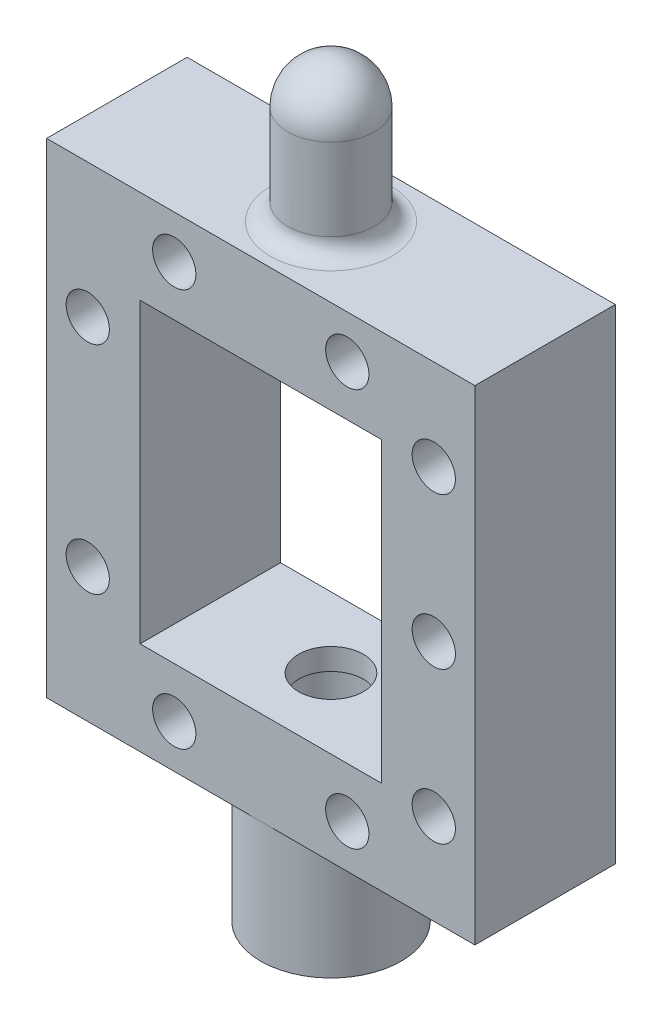
ISO-10303-21;
HEADER;
FILE_DESCRIPTION(('STEP AP214'),'2;1');
FILE_NAME('part.step','',(''),(''),'','','');
FILE_SCHEMA(('AUTOMOTIVE_DESIGN { 1 0 10303 214 1 1 1 1 }'));
ENDSEC;
DATA;
#1=APPLICATION_CONTEXT('core data for automotive mechanical design processes');
#2=APPLICATION_PROTOCOL_DEFINITION('international standard','automotive_design',2000,#1);
#3=PRODUCT_CONTEXT('',#1,'mechanical');
#4=PRODUCT('Part','Part','',(#3));
#5=PRODUCT_RELATED_PRODUCT_CATEGORY('part','',(#4));
#6=PRODUCT_DEFINITION_FORMATION('','',#4);
#7=PRODUCT_DEFINITION_CONTEXT('part definition',#1,'design');
#8=PRODUCT_DEFINITION('design','',#6,#7);
#9=PRODUCT_DEFINITION_SHAPE('','',#8);
#10=(LENGTH_UNIT() NAMED_UNIT(*) SI_UNIT(.MILLI.,.METRE.));
#11=(NAMED_UNIT(*) PLANE_ANGLE_UNIT() SI_UNIT($,.RADIAN.));
#12=(NAMED_UNIT(*) SI_UNIT($,.STERADIAN.) SOLID_ANGLE_UNIT());
#13=UNCERTAINTY_MEASURE_WITH_UNIT(LENGTH_MEASURE(1.E-05),#10,'distance_accuracy_value','');
#14=(GEOMETRIC_REPRESENTATION_CONTEXT(3) GLOBAL_UNCERTAINTY_ASSIGNED_CONTEXT((#13)) GLOBAL_UNIT_ASSIGNED_CONTEXT((#10,
#11,#12)) REPRESENTATION_CONTEXT('',''));
#15=CARTESIAN_POINT('',(0.,0.,0.));
#16=DIRECTION('',(0.,0.,1.));
#17=DIRECTION('',(1.,0.,0.));
#18=AXIS2_PLACEMENT_3D('',#15,#16,#17);
#19=CARTESIAN_POINT('',(0.,-53.34,10.3124));
#20=DIRECTION('',(0.,1.,0.));
#21=DIRECTION('',(0.,0.,1.));
#22=AXIS2_PLACEMENT_3D('',#19,#20,#21);
#23=CYLINDRICAL_SURFACE('',#22,10.3124);
#24=DIRECTION('',(0.,-1.,0.));
#25=VECTOR('',#24,1.);
#26=CARTESIAN_POINT('',(-7.39959695393663,-35.56,3.12967359011276));
#27=LINE('',#26,#25);
#28=CARTESIAN_POINT('',(-7.39959695393663,-35.56,3.12967359011276));
#29=VERTEX_POINT('',#28);
#30=CARTESIAN_POINT('',(-7.39959695393663,-53.34,3.12967359011276));
#31=VERTEX_POINT('',#30);
#32=EDGE_CURVE('E119',#29,#31,#27,.T.);
#33=ORIENTED_EDGE('',*,*,#32,.T.);
#34=CARTESIAN_POINT('',(0.,-53.34,10.3124));
#35=DIRECTION('',(0.,-1.,0.));
#36=DIRECTION('',(0.,0.,-1.));
#37=AXIS2_PLACEMENT_3D('',#34,#35,#36);
#38=CIRCLE('',#37,10.3124);
#39=CARTESIAN_POINT('',(7.39959695393663,-53.34,3.12967359011275));
#40=VERTEX_POINT('',#39);
#41=EDGE_CURVE('E125',#40,#31,#38,.T.);
#42=ORIENTED_EDGE('',*,*,#41,.F.);
#43=DIRECTION('',(0.,-1.,0.));
#44=VECTOR('',#43,1.);
#45=CARTESIAN_POINT('',(7.39959695393663,-35.56,3.12967359011276));
#46=LINE('',#45,#44);
#47=CARTESIAN_POINT('',(7.39959695393663,-35.56,3.12967359011276));
#48=VERTEX_POINT('',#47);
#49=EDGE_CURVE('E54',#48,#40,#46,.T.);
#50=ORIENTED_EDGE('',*,*,#49,.F.);
#51=CARTESIAN_POINT('',(0.,-35.56,10.3124));
#52=DIRECTION('',(0.,-1.,0.));
#53=DIRECTION('',(0.,0.,-1.));
#54=AXIS2_PLACEMENT_3D('',#51,#52,#53);
#55=CIRCLE('',#54,10.3124);
#56=CARTESIAN_POINT('',(0.,-35.56,20.6248));
#57=VERTEX_POINT('',#56);
#58=EDGE_CURVE('E47',#48,#57,#55,.T.);
#59=ORIENTED_EDGE('',*,*,#58,.T.);
#60=EDGE_CURVE('E11',#57,#29,#55,.T.);
#61=ORIENTED_EDGE('',*,*,#60,.T.);
#62=EDGE_LOOP('',(#33,#42,#50,#59,#61));
#63=FACE_BOUND('',#62,.T.);
#64=ADVANCED_FACE('F37',(#63),#23,.T.);
#65=CARTESIAN_POINT('',(0.,-53.34,10.3124));
#66=DIRECTION('',(0.,-1.,0.));
#67=DIRECTION('',(0.,0.,-1.));
#68=AXIS2_PLACEMENT_3D('',#65,#66,#67);
#69=PLANE('',#68);
#70=CARTESIAN_POINT('',(0.,-53.34,10.3124));
#71=DIRECTION('',(0.,-1.,0.));
#72=DIRECTION('',(0.,0.,-1.));
#73=AXIS2_PLACEMENT_3D('',#70,#71,#72);
#74=CIRCLE('',#73,5.75436999999999);
#75=CARTESIAN_POINT('',(0.,-53.34,4.55803000000001));
#76=VERTEX_POINT('',#75);
#77=EDGE_CURVE('E395',#76,#76,#74,.T.);
#78=ORIENTED_EDGE('',*,*,#77,.F.);
#79=EDGE_LOOP('',(#78));
#80=FACE_BOUND('',#79,.T.);
#81=ORIENTED_EDGE('',*,*,#41,.T.);
#82=DIRECTION('',(1.,0.,0.));
#83=VECTOR('',#82,1.);
#84=CARTESIAN_POINT('',(-7.39959695393663,-53.34,3.12967359011276));
#85=LINE('',#84,#83);
#86=EDGE_CURVE('E121',#31,#40,#85,.T.);
#87=ORIENTED_EDGE('',*,*,#86,.T.);
#88=EDGE_LOOP('',(#81,#87));
#89=FACE_BOUND('',#88,.T.);
#90=ADVANCED_FACE('F283',(#80,#89),#69,.T.);
#91=CARTESIAN_POINT('',(31.4325,35.56,20.6248));
#92=DIRECTION('',(-1.,0.,0.));
#93=DIRECTION('',(0.,-1.,0.));
#94=AXIS2_PLACEMENT_3D('',#91,#92,#93);
#95=PLANE('',#94);
#96=DIRECTION('',(0.,1.,0.));
#97=VECTOR('',#96,1.);
#98=CARTESIAN_POINT('',(31.4325,35.56,0.));
#99=LINE('',#98,#97);
#100=CARTESIAN_POINT('',(31.4325,-35.56,0.));
#101=VERTEX_POINT('',#100);
#102=CARTESIAN_POINT('',(31.4325,35.56,0.));
#103=VERTEX_POINT('',#102);
#104=EDGE_CURVE('E230',#101,#103,#99,.T.);
#105=ORIENTED_EDGE('',*,*,#104,.T.);
#106=DIRECTION('',(0.,0.,-1.));
#107=VECTOR('',#106,1.);
#108=CARTESIAN_POINT('',(31.4325,35.56,20.6248));
#109=LINE('',#108,#107);
#110=CARTESIAN_POINT('',(31.4325,35.56,20.6248));
#111=VERTEX_POINT('',#110);
#112=EDGE_CURVE('E257',#111,#103,#109,.T.);
#113=ORIENTED_EDGE('',*,*,#112,.F.);
#114=DIRECTION('',(0.,1.,0.));
#115=VECTOR('',#114,1.);
#116=CARTESIAN_POINT('',(31.4325,35.56,20.6248));
#117=LINE('',#116,#115);
#118=CARTESIAN_POINT('',(31.4325,-35.56,20.6248));
#119=VERTEX_POINT('',#118);
#120=EDGE_CURVE('E231',#119,#111,#117,.T.);
#121=ORIENTED_EDGE('',*,*,#120,.F.);
#122=DIRECTION('',(0.,0.,-1.));
#123=VECTOR('',#122,1.);
#124=CARTESIAN_POINT('',(31.4325,-35.56,20.6248));
#125=LINE('',#124,#123);
#126=EDGE_CURVE('E241',#119,#101,#125,.T.);
#127=ORIENTED_EDGE('',*,*,#126,.T.);
#128=EDGE_LOOP('',(#105,#113,#121,#127));
#129=FACE_BOUND('',#128,.T.);
#130=ADVANCED_FACE('F289',(#129),#95,.F.);
#131=CARTESIAN_POINT('',(-31.4325,35.56,20.6248));
#132=DIRECTION('',(0.,-1.,0.));
#133=DIRECTION('',(1.,0.,0.));
#134=AXIS2_PLACEMENT_3D('',#131,#132,#133);
#135=PLANE('',#134);
#136=CARTESIAN_POINT('',(0.,35.56,10.3124));
#137=DIRECTION('',(0.,-1.,0.));
#138=DIRECTION('',(1.,0.,0.));
#139=AXIS2_PLACEMENT_3D('',#136,#137,#138);
#140=CIRCLE('',#139,8.89);
#141=CARTESIAN_POINT('',(8.89,35.56,10.3124));
#142=VERTEX_POINT('',#141);
#143=EDGE_CURVE('E259',#142,#142,#140,.T.);
#144=ORIENTED_EDGE('',*,*,#143,.T.);
#145=EDGE_LOOP('',(#144));
#146=FACE_BOUND('',#145,.T.);
#147=DIRECTION('',(-1.,0.,0.));
#148=VECTOR('',#147,1.);
#149=CARTESIAN_POINT('',(-31.4325,35.56,0.));
#150=LINE('',#149,#148);
#151=CARTESIAN_POINT('',(-31.4325,35.56,0.));
#152=VERTEX_POINT('',#151);
#153=EDGE_CURVE('E244',#103,#152,#150,.T.);
#154=ORIENTED_EDGE('',*,*,#153,.T.);
#155=DIRECTION('',(0.,0.,-1.));
#156=VECTOR('',#155,1.);
#157=CARTESIAN_POINT('',(-31.4325,35.56,20.6248));
#158=LINE('',#157,#156);
#159=CARTESIAN_POINT('',(-31.4325,35.56,20.6248));
#160=VERTEX_POINT('',#159);
#161=EDGE_CURVE('E254',#160,#152,#158,.T.);
#162=ORIENTED_EDGE('',*,*,#161,.F.);
#163=DIRECTION('',(-1.,0.,0.));
#164=VECTOR('',#163,1.);
#165=CARTESIAN_POINT('',(-31.4325,35.56,20.6248));
#166=LINE('',#165,#164);
#167=EDGE_CURVE('E234',#111,#160,#166,.T.);
#168=ORIENTED_EDGE('',*,*,#167,.F.);
#169=ORIENTED_EDGE('',*,*,#112,.T.);
#170=EDGE_LOOP('',(#154,#162,#168,#169));
#171=FACE_BOUND('',#170,.T.);
#172=ADVANCED_FACE('F364',(#146,#171),#135,.F.);
#173=CARTESIAN_POINT('',(-31.4325,35.56,20.6248));
#174=DIRECTION('',(1.,0.,0.));
#175=DIRECTION('',(0.,0.,-1.));
#176=AXIS2_PLACEMENT_3D('',#173,#174,#175);
#177=PLANE('',#176);
#178=DIRECTION('',(0.,-1.,0.));
#179=VECTOR('',#178,1.);
#180=CARTESIAN_POINT('',(-31.4325,35.56,0.));
#181=LINE('',#180,#179);
#182=CARTESIAN_POINT('',(-31.4325,-35.56,0.));
#183=VERTEX_POINT('',#182);
#184=EDGE_CURVE('E246',#152,#183,#181,.T.);
#185=ORIENTED_EDGE('',*,*,#184,.T.);
#186=DIRECTION('',(0.,0.,-1.));
#187=VECTOR('',#186,1.);
#188=CARTESIAN_POINT('',(-31.4325,-35.56,20.6248));
#189=LINE('',#188,#187);
#190=CARTESIAN_POINT('',(-31.4325,-35.56,20.6248));
#191=VERTEX_POINT('',#190);
#192=EDGE_CURVE('E251',#191,#183,#189,.T.);
#193=ORIENTED_EDGE('',*,*,#192,.F.);
#194=DIRECTION('',(0.,-1.,0.));
#195=VECTOR('',#194,1.);
#196=CARTESIAN_POINT('',(-31.4325,35.56,20.6248));
#197=LINE('',#196,#195);
#198=EDGE_CURVE('E237',#160,#191,#197,.T.);
#199=ORIENTED_EDGE('',*,*,#198,.F.);
#200=ORIENTED_EDGE('',*,*,#161,.T.);
#201=EDGE_LOOP('',(#185,#193,#199,#200));
#202=FACE_BOUND('',#201,.T.);
#203=ADVANCED_FACE('F361',(#202),#177,.F.);
#204=CARTESIAN_POINT('',(-31.4325,-35.56,20.6248));
#205=DIRECTION('',(0.,1.,0.));
#206=DIRECTION('',(0.,0.,1.));
#207=AXIS2_PLACEMENT_3D('',#204,#205,#206);
#208=PLANE('',#207);
#209=ORIENTED_EDGE('',*,*,#60,.F.);
#210=DIRECTION('',(1.,0.,0.));
#211=VECTOR('',#210,1.);
#212=CARTESIAN_POINT('',(-31.4325,-35.56,20.6248));
#213=LINE('',#212,#211);
#214=EDGE_CURVE('E239',#191,#57,#213,.T.);
#215=ORIENTED_EDGE('',*,*,#214,.F.);
#216=ORIENTED_EDGE('',*,*,#192,.T.);
#217=DIRECTION('',(1.,0.,0.));
#218=VECTOR('',#217,1.);
#219=CARTESIAN_POINT('',(-31.4325,-35.56,0.));
#220=LINE('',#219,#218);
#221=EDGE_CURVE('E235',#183,#101,#220,.T.);
#222=ORIENTED_EDGE('',*,*,#221,.T.);
#223=ORIENTED_EDGE('',*,*,#126,.F.);
#224=EDGE_CURVE('E130',#57,#119,#213,.T.);
#225=ORIENTED_EDGE('',*,*,#224,.F.);
#226=ORIENTED_EDGE('',*,*,#58,.F.);
#227=DIRECTION('',(1.,0.,0.));
#228=VECTOR('',#227,1.);
#229=CARTESIAN_POINT('',(-5.79537806139285,-35.56,3.12967359011275));
#230=LINE('',#229,#228);
#231=EDGE_CURVE('E116',#29,#48,#230,.T.);
#232=ORIENTED_EDGE('',*,*,#231,.F.);
#233=EDGE_LOOP('',(#209,#215,#216,#222,#223,#225,#226,#232));
#234=FACE_BOUND('',#233,.T.);
#235=ADVANCED_FACE('F128',(#234),#208,.F.);
#236=CARTESIAN_POINT('',(0.,0.,20.6248));
#237=DIRECTION('',(0.,0.,1.));
#238=DIRECTION('',(1.,0.,0.));
#239=AXIS2_PLACEMENT_3D('',#236,#237,#238);
#240=PLANE('',#239);
#241=DIRECTION('',(0.,1.,0.));
#242=VECTOR('',#241,1.);
#243=CARTESIAN_POINT('',(17.7165,21.844,20.6248));
#244=LINE('',#243,#242);
#245=CARTESIAN_POINT('',(17.7165,-21.844,20.6248));
#246=VERTEX_POINT('',#245);
#247=CARTESIAN_POINT('',(17.7165,21.844,20.6248));
#248=VERTEX_POINT('',#247);
#249=EDGE_CURVE('E139',#246,#248,#244,.T.);
#250=ORIENTED_EDGE('',*,*,#249,.F.);
#251=DIRECTION('',(1.,0.,0.));
#252=VECTOR('',#251,1.);
#253=CARTESIAN_POINT('',(-17.7165,-21.844,20.6248));
#254=LINE('',#253,#252);
#255=CARTESIAN_POINT('',(-17.7165,-21.844,20.6248));
#256=VERTEX_POINT('',#255);
#257=EDGE_CURVE('E146',#256,#246,#254,.T.);
#258=ORIENTED_EDGE('',*,*,#257,.F.);
#259=DIRECTION('',(0.,-1.,0.));
#260=VECTOR('',#259,1.);
#261=CARTESIAN_POINT('',(-17.7165,21.844,20.6248));
#262=LINE('',#261,#260);
#263=CARTESIAN_POINT('',(-17.7165,21.844,20.6248));
#264=VERTEX_POINT('',#263);
#265=EDGE_CURVE('E160',#264,#256,#262,.T.);
#266=ORIENTED_EDGE('',*,*,#265,.F.);
#267=DIRECTION('',(-1.,0.,0.));
#268=VECTOR('',#267,1.);
#269=CARTESIAN_POINT('',(-17.7165,21.844,20.6248));
#270=LINE('',#269,#268);
#271=EDGE_CURVE('E157',#248,#264,#270,.T.);
#272=ORIENTED_EDGE('',*,*,#271,.F.);
#273=EDGE_LOOP('',(#250,#258,#266,#272));
#274=FACE_BOUND('',#273,.T.);
#275=CARTESIAN_POINT('',(12.7,-29.21,20.6248));
#276=DIRECTION('',(0.,0.,1.));
#277=DIRECTION('',(1.,0.,0.));
#278=AXIS2_PLACEMENT_3D('',#275,#276,#277);
#279=CIRCLE('',#278,3.175);
#280=CARTESIAN_POINT('',(15.875,-29.21,20.6248));
#281=VERTEX_POINT('',#280);
#282=EDGE_CURVE('E227',#281,#281,#279,.T.);
#283=ORIENTED_EDGE('',*,*,#282,.F.);
#284=EDGE_LOOP('',(#283));
#285=FACE_BOUND('',#284,.T.);
#286=CARTESIAN_POINT('',(-25.4,-15.875,20.6248));
#287=DIRECTION('',(0.,0.,1.));
#288=DIRECTION('',(1.,0.,0.));
#289=AXIS2_PLACEMENT_3D('',#286,#287,#288);
#290=CIRCLE('',#289,3.175);
#291=CARTESIAN_POINT('',(-22.225,-15.875,20.6248));
#292=VERTEX_POINT('',#291);
#293=EDGE_CURVE('E224',#292,#292,#290,.T.);
#294=ORIENTED_EDGE('',*,*,#293,.F.);
#295=EDGE_LOOP('',(#294));
#296=FACE_BOUND('',#295,.T.);
#297=CARTESIAN_POINT('',(-12.7,-29.21,20.6248));
#298=DIRECTION('',(0.,0.,1.));
#299=DIRECTION('',(1.,0.,0.));
#300=AXIS2_PLACEMENT_3D('',#297,#298,#299);
#301=CIRCLE('',#300,3.175);
#302=CARTESIAN_POINT('',(-9.525,-29.21,20.6248));
#303=VERTEX_POINT('',#302);
#304=EDGE_CURVE('E221',#303,#303,#301,.T.);
#305=ORIENTED_EDGE('',*,*,#304,.F.);
#306=EDGE_LOOP('',(#305));
#307=FACE_BOUND('',#306,.T.);
#308=CARTESIAN_POINT('',(-25.4,15.875,20.6248));
#309=DIRECTION('',(0.,0.,1.));
#310=DIRECTION('',(1.,0.,0.));
#311=AXIS2_PLACEMENT_3D('',#308,#309,#310);
#312=CIRCLE('',#311,3.175);
#313=CARTESIAN_POINT('',(-22.225,15.875,20.6248));
#314=VERTEX_POINT('',#313);
#315=EDGE_CURVE('E218',#314,#314,#312,.T.);
#316=ORIENTED_EDGE('',*,*,#315,.F.);
#317=EDGE_LOOP('',(#316));
#318=FACE_BOUND('',#317,.T.);
#319=CARTESIAN_POINT('',(25.4,-22.225,20.6248));
#320=DIRECTION('',(0.,0.,1.));
#321=DIRECTION('',(1.,0.,0.));
#322=AXIS2_PLACEMENT_3D('',#319,#320,#321);
#323=CIRCLE('',#322,3.175);
#324=CARTESIAN_POINT('',(28.575,-22.225,20.6248));
#325=VERTEX_POINT('',#324);
#326=EDGE_CURVE('E215',#325,#325,#323,.T.);
#327=ORIENTED_EDGE('',*,*,#326,.F.);
#328=EDGE_LOOP('',(#327));
#329=FACE_BOUND('',#328,.T.);
#330=CARTESIAN_POINT('',(25.4,22.225,20.6248));
#331=DIRECTION('',(0.,0.,1.));
#332=DIRECTION('',(1.,0.,0.));
#333=AXIS2_PLACEMENT_3D('',#330,#331,#332);
#334=CIRCLE('',#333,3.175);
#335=CARTESIAN_POINT('',(28.575,22.225,20.6248));
#336=VERTEX_POINT('',#335);
#337=EDGE_CURVE('E212',#336,#336,#334,.T.);
#338=ORIENTED_EDGE('',*,*,#337,.F.);
#339=EDGE_LOOP('',(#338));
#340=FACE_BOUND('',#339,.T.);
#341=CARTESIAN_POINT('',(25.4,0.,20.6248));
#342=DIRECTION('',(0.,0.,1.));
#343=DIRECTION('',(1.,0.,0.));
#344=AXIS2_PLACEMENT_3D('',#341,#342,#343);
#345=CIRCLE('',#344,3.175);
#346=CARTESIAN_POINT('',(28.575,0.,20.6248));
#347=VERTEX_POINT('',#346);
#348=EDGE_CURVE('E209',#347,#347,#345,.T.);
#349=ORIENTED_EDGE('',*,*,#348,.F.);
#350=EDGE_LOOP('',(#349));
#351=FACE_BOUND('',#350,.T.);
#352=CARTESIAN_POINT('',(12.7,29.21,20.6248));
#353=DIRECTION('',(0.,0.,1.));
#354=DIRECTION('',(1.,0.,0.));
#355=AXIS2_PLACEMENT_3D('',#352,#353,#354);
#356=CIRCLE('',#355,3.175);
#357=CARTESIAN_POINT('',(15.875,29.21,20.6248));
#358=VERTEX_POINT('',#357);
#359=EDGE_CURVE('E206',#358,#358,#356,.T.);
#360=ORIENTED_EDGE('',*,*,#359,.F.);
#361=EDGE_LOOP('',(#360));
#362=FACE_BOUND('',#361,.T.);
#363=CARTESIAN_POINT('',(-12.7,29.21,20.6248));
#364=DIRECTION('',(0.,0.,1.));
#365=DIRECTION('',(1.,0.,0.));
#366=AXIS2_PLACEMENT_3D('',#363,#364,#365);
#367=CIRCLE('',#366,3.175);
#368=CARTESIAN_POINT('',(-9.525,29.21,20.6248));
#369=VERTEX_POINT('',#368);
#370=EDGE_CURVE('E203',#369,#369,#367,.T.);
#371=ORIENTED_EDGE('',*,*,#370,.F.);
#372=EDGE_LOOP('',(#371));
#373=FACE_BOUND('',#372,.T.);
#374=ORIENTED_EDGE('',*,*,#120,.T.);
#375=ORIENTED_EDGE('',*,*,#167,.T.);
#376=ORIENTED_EDGE('',*,*,#198,.T.);
#377=ORIENTED_EDGE('',*,*,#214,.T.);
#378=ORIENTED_EDGE('',*,*,#224,.T.);
#379=EDGE_LOOP('',(#374,#375,#376,#377,#378));
#380=FACE_BOUND('',#379,.T.);
#381=ADVANCED_FACE('F352',(#274,#285,#296,#307,#318,#329,#340,#351,#362,#373,#380),#240,.T.);
#382=CARTESIAN_POINT('',(0.,0.,0.));
#383=DIRECTION('',(0.,0.,1.));
#384=DIRECTION('',(1.,0.,0.));
#385=AXIS2_PLACEMENT_3D('',#382,#383,#384);
#386=PLANE('',#385);
#387=DIRECTION('',(1.,0.,0.));
#388=VECTOR('',#387,1.);
#389=CARTESIAN_POINT('',(-17.7165,-21.844,0.));
#390=LINE('',#389,#388);
#391=CARTESIAN_POINT('',(-17.7165,-21.844,0.));
#392=VERTEX_POINT('',#391);
#393=CARTESIAN_POINT('',(17.7165,-21.844,0.));
#394=VERTEX_POINT('',#393);
#395=EDGE_CURVE('E152',#392,#394,#390,.T.);
#396=ORIENTED_EDGE('',*,*,#395,.T.);
#397=DIRECTION('',(0.,1.,0.));
#398=VECTOR('',#397,1.);
#399=CARTESIAN_POINT('',(17.7165,21.844,0.));
#400=LINE('',#399,#398);
#401=CARTESIAN_POINT('',(17.7165,21.844,0.));
#402=VERTEX_POINT('',#401);
#403=EDGE_CURVE('E142',#394,#402,#400,.T.);
#404=ORIENTED_EDGE('',*,*,#403,.T.);
#405=DIRECTION('',(-1.,0.,0.));
#406=VECTOR('',#405,1.);
#407=CARTESIAN_POINT('',(-17.7165,21.844,0.));
#408=LINE('',#407,#406);
#409=CARTESIAN_POINT('',(-17.7165,21.844,0.));
#410=VERTEX_POINT('',#409);
#411=EDGE_CURVE('E145',#402,#410,#408,.T.);
#412=ORIENTED_EDGE('',*,*,#411,.T.);
#413=DIRECTION('',(0.,-1.,0.));
#414=VECTOR('',#413,1.);
#415=CARTESIAN_POINT('',(-17.7165,21.844,0.));
#416=LINE('',#415,#414);
#417=EDGE_CURVE('E149',#410,#392,#416,.T.);
#418=ORIENTED_EDGE('',*,*,#417,.T.);
#419=EDGE_LOOP('',(#396,#404,#412,#418));
#420=FACE_BOUND('',#419,.T.);
#421=CARTESIAN_POINT('',(12.7,-29.21,0.));
#422=DIRECTION('',(0.,0.,1.));
#423=DIRECTION('',(1.,0.,0.));
#424=AXIS2_PLACEMENT_3D('',#421,#422,#423);
#425=CIRCLE('',#424,3.175);
#426=CARTESIAN_POINT('',(15.875,-29.21,0.));
#427=VERTEX_POINT('',#426);
#428=EDGE_CURVE('E186',#427,#427,#425,.T.);
#429=ORIENTED_EDGE('',*,*,#428,.T.);
#430=EDGE_LOOP('',(#429));
#431=FACE_BOUND('',#430,.T.);
#432=CARTESIAN_POINT('',(-25.4,-15.875,0.));
#433=DIRECTION('',(0.,0.,1.));
#434=DIRECTION('',(-1.,0.,0.));
#435=AXIS2_PLACEMENT_3D('',#432,#433,#434);
#436=CIRCLE('',#435,3.175);
#437=CARTESIAN_POINT('',(-28.575,-15.875,0.));
#438=VERTEX_POINT('',#437);
#439=EDGE_CURVE('E189',#438,#438,#436,.T.);
#440=ORIENTED_EDGE('',*,*,#439,.T.);
#441=EDGE_LOOP('',(#440));
#442=FACE_BOUND('',#441,.T.);
#443=CARTESIAN_POINT('',(-12.7,-29.21,0.));
#444=DIRECTION('',(0.,0.,1.));
#445=DIRECTION('',(-1.,0.,0.));
#446=AXIS2_PLACEMENT_3D('',#443,#444,#445);
#447=CIRCLE('',#446,3.175);
#448=CARTESIAN_POINT('',(-15.875,-29.21,0.));
#449=VERTEX_POINT('',#448);
#450=EDGE_CURVE('E192',#449,#449,#447,.T.);
#451=ORIENTED_EDGE('',*,*,#450,.T.);
#452=EDGE_LOOP('',(#451));
#453=FACE_BOUND('',#452,.T.);
#454=CARTESIAN_POINT('',(-25.4,15.875,0.));
#455=DIRECTION('',(0.,0.,1.));
#456=DIRECTION('',(1.,0.,0.));
#457=AXIS2_PLACEMENT_3D('',#454,#455,#456);
#458=CIRCLE('',#457,3.175);
#459=CARTESIAN_POINT('',(-22.225,15.875,0.));
#460=VERTEX_POINT('',#459);
#461=EDGE_CURVE('E195',#460,#460,#458,.T.);
#462=ORIENTED_EDGE('',*,*,#461,.T.);
#463=EDGE_LOOP('',(#462));
#464=FACE_BOUND('',#463,.T.);
#465=CARTESIAN_POINT('',(25.4,-22.225,0.));
#466=DIRECTION('',(0.,0.,1.));
#467=DIRECTION('',(-1.,0.,0.));
#468=AXIS2_PLACEMENT_3D('',#465,#466,#467);
#469=CIRCLE('',#468,3.175);
#470=CARTESIAN_POINT('',(22.225,-22.225,0.));
#471=VERTEX_POINT('',#470);
#472=EDGE_CURVE('E176',#471,#471,#469,.T.);
#473=ORIENTED_EDGE('',*,*,#472,.T.);
#474=EDGE_LOOP('',(#473));
#475=FACE_BOUND('',#474,.T.);
#476=CARTESIAN_POINT('',(25.4,22.225,0.));
#477=DIRECTION('',(0.,0.,1.));
#478=DIRECTION('',(1.,0.,0.));
#479=AXIS2_PLACEMENT_3D('',#476,#477,#478);
#480=CIRCLE('',#479,3.175);
#481=CARTESIAN_POINT('',(28.575,22.225,0.));
#482=VERTEX_POINT('',#481);
#483=EDGE_CURVE('E177',#482,#482,#480,.T.);
#484=ORIENTED_EDGE('',*,*,#483,.T.);
#485=EDGE_LOOP('',(#484));
#486=FACE_BOUND('',#485,.T.);
#487=CARTESIAN_POINT('',(25.4,0.,0.));
#488=DIRECTION('',(0.,0.,1.));
#489=DIRECTION('',(1.,0.,0.));
#490=AXIS2_PLACEMENT_3D('',#487,#488,#489);
#491=CIRCLE('',#490,3.175);
#492=CARTESIAN_POINT('',(28.575,0.,0.));
#493=VERTEX_POINT('',#492);
#494=EDGE_CURVE('E180',#493,#493,#491,.T.);
#495=ORIENTED_EDGE('',*,*,#494,.T.);
#496=EDGE_LOOP('',(#495));
#497=FACE_BOUND('',#496,.T.);
#498=CARTESIAN_POINT('',(12.7,29.21,0.));
#499=DIRECTION('',(0.,0.,1.));
#500=DIRECTION('',(-1.,0.,0.));
#501=AXIS2_PLACEMENT_3D('',#498,#499,#500);
#502=CIRCLE('',#501,3.175);
#503=CARTESIAN_POINT('',(9.525,29.21,0.));
#504=VERTEX_POINT('',#503);
#505=EDGE_CURVE('E183',#504,#504,#502,.T.);
#506=ORIENTED_EDGE('',*,*,#505,.T.);
#507=EDGE_LOOP('',(#506));
#508=FACE_BOUND('',#507,.T.);
#509=CARTESIAN_POINT('',(-12.7,29.21,0.));
#510=DIRECTION('',(0.,0.,1.));
#511=DIRECTION('',(1.,0.,0.));
#512=AXIS2_PLACEMENT_3D('',#509,#510,#511);
#513=CIRCLE('',#512,3.175);
#514=CARTESIAN_POINT('',(-9.525,29.21,0.));
#515=VERTEX_POINT('',#514);
#516=EDGE_CURVE('E198',#515,#515,#513,.T.);
#517=ORIENTED_EDGE('',*,*,#516,.T.);
#518=EDGE_LOOP('',(#517));
#519=FACE_BOUND('',#518,.T.);
#520=ORIENTED_EDGE('',*,*,#104,.F.);
#521=ORIENTED_EDGE('',*,*,#221,.F.);
#522=ORIENTED_EDGE('',*,*,#184,.F.);
#523=ORIENTED_EDGE('',*,*,#153,.F.);
#524=EDGE_LOOP('',(#520,#521,#522,#523));
#525=FACE_BOUND('',#524,.T.);
#526=ADVANCED_FACE('F350',(#420,#431,#442,#453,#464,#475,#486,#497,#508,#519,#525),#386,.F.);
#527=CARTESIAN_POINT('',(-12.7,29.21,0.));
#528=DIRECTION('',(0.,0.,1.));
#529=DIRECTION('',(1.,0.,0.));
#530=AXIS2_PLACEMENT_3D('',#527,#528,#529);
#531=CYLINDRICAL_SURFACE('',#530,3.175);
#532=ORIENTED_EDGE('',*,*,#370,.T.);
#533=EDGE_LOOP('',(#532));
#534=FACE_BOUND('',#533,.T.);
#535=ORIENTED_EDGE('',*,*,#516,.F.);
#536=EDGE_LOOP('',(#535));
#537=FACE_BOUND('',#536,.T.);
#538=ADVANCED_FACE('F329',(#534,#537),#531,.F.);
#539=CARTESIAN_POINT('',(12.7,29.21,0.));
#540=DIRECTION('',(0.,0.,1.));
#541=DIRECTION('',(1.,0.,0.));
#542=AXIS2_PLACEMENT_3D('',#539,#540,#541);
#543=CYLINDRICAL_SURFACE('',#542,3.175);
#544=ORIENTED_EDGE('',*,*,#359,.T.);
#545=EDGE_LOOP('',(#544));
#546=FACE_BOUND('',#545,.T.);
#547=ORIENTED_EDGE('',*,*,#505,.F.);
#548=EDGE_LOOP('',(#547));
#549=FACE_BOUND('',#548,.T.);
#550=ADVANCED_FACE('F326',(#546,#549),#543,.F.);
#551=CARTESIAN_POINT('',(25.4,0.,0.));
#552=DIRECTION('',(0.,0.,1.));
#553=DIRECTION('',(1.,0.,0.));
#554=AXIS2_PLACEMENT_3D('',#551,#552,#553);
#555=CYLINDRICAL_SURFACE('',#554,3.175);
#556=ORIENTED_EDGE('',*,*,#348,.T.);
#557=EDGE_LOOP('',(#556));
#558=FACE_BOUND('',#557,.T.);
#559=ORIENTED_EDGE('',*,*,#494,.F.);
#560=EDGE_LOOP('',(#559));
#561=FACE_BOUND('',#560,.T.);
#562=ADVANCED_FACE('F320',(#558,#561),#555,.F.);
#563=CARTESIAN_POINT('',(25.4,22.225,0.));
#564=DIRECTION('',(0.,0.,1.));
#565=DIRECTION('',(1.,0.,0.));
#566=AXIS2_PLACEMENT_3D('',#563,#564,#565);
#567=CYLINDRICAL_SURFACE('',#566,3.175);
#568=ORIENTED_EDGE('',*,*,#337,.T.);
#569=EDGE_LOOP('',(#568));
#570=FACE_BOUND('',#569,.T.);
#571=ORIENTED_EDGE('',*,*,#483,.F.);
#572=EDGE_LOOP('',(#571));
#573=FACE_BOUND('',#572,.T.);
#574=ADVANCED_FACE('F316',(#570,#573),#567,.F.);
#575=CARTESIAN_POINT('',(25.4,-22.225,0.));
#576=DIRECTION('',(0.,0.,1.));
#577=DIRECTION('',(1.,0.,0.));
#578=AXIS2_PLACEMENT_3D('',#575,#576,#577);
#579=CYLINDRICAL_SURFACE('',#578,3.175);
#580=ORIENTED_EDGE('',*,*,#326,.T.);
#581=EDGE_LOOP('',(#580));
#582=FACE_BOUND('',#581,.T.);
#583=ORIENTED_EDGE('',*,*,#472,.F.);
#584=EDGE_LOOP('',(#583));
#585=FACE_BOUND('',#584,.T.);
#586=ADVANCED_FACE('F319',(#582,#585),#579,.F.);
#587=CARTESIAN_POINT('',(-25.4,15.875,0.));
#588=DIRECTION('',(0.,0.,1.));
#589=DIRECTION('',(1.,0.,0.));
#590=AXIS2_PLACEMENT_3D('',#587,#588,#589);
#591=CYLINDRICAL_SURFACE('',#590,3.175);
#592=ORIENTED_EDGE('',*,*,#315,.T.);
#593=EDGE_LOOP('',(#592));
#594=FACE_BOUND('',#593,.T.);
#595=ORIENTED_EDGE('',*,*,#461,.F.);
#596=EDGE_LOOP('',(#595));
#597=FACE_BOUND('',#596,.T.);
#598=ADVANCED_FACE('F324',(#594,#597),#591,.F.);
#599=CARTESIAN_POINT('',(-12.7,-29.21,0.));
#600=DIRECTION('',(0.,0.,1.));
#601=DIRECTION('',(1.,0.,0.));
#602=AXIS2_PLACEMENT_3D('',#599,#600,#601);
#603=CYLINDRICAL_SURFACE('',#602,3.175);
#604=ORIENTED_EDGE('',*,*,#304,.T.);
#605=EDGE_LOOP('',(#604));
#606=FACE_BOUND('',#605,.T.);
#607=ORIENTED_EDGE('',*,*,#450,.F.);
#608=EDGE_LOOP('',(#607));
#609=FACE_BOUND('',#608,.T.);
#610=ADVANCED_FACE('F337',(#606,#609),#603,.F.);
#611=CARTESIAN_POINT('',(-25.4,-15.875,0.));
#612=DIRECTION('',(0.,0.,1.));
#613=DIRECTION('',(1.,0.,0.));
#614=AXIS2_PLACEMENT_3D('',#611,#612,#613);
#615=CYLINDRICAL_SURFACE('',#614,3.175);
#616=ORIENTED_EDGE('',*,*,#293,.T.);
#617=EDGE_LOOP('',(#616));
#618=FACE_BOUND('',#617,.T.);
#619=ORIENTED_EDGE('',*,*,#439,.F.);
#620=EDGE_LOOP('',(#619));
#621=FACE_BOUND('',#620,.T.);
#622=ADVANCED_FACE('F334',(#618,#621),#615,.F.);
#623=CARTESIAN_POINT('',(12.7,-29.21,0.));
#624=DIRECTION('',(0.,0.,1.));
#625=DIRECTION('',(1.,0.,0.));
#626=AXIS2_PLACEMENT_3D('',#623,#624,#625);
#627=CYLINDRICAL_SURFACE('',#626,3.175);
#628=ORIENTED_EDGE('',*,*,#282,.T.);
#629=EDGE_LOOP('',(#628));
#630=FACE_BOUND('',#629,.T.);
#631=ORIENTED_EDGE('',*,*,#428,.F.);
#632=EDGE_LOOP('',(#631));
#633=FACE_BOUND('',#632,.T.);
#634=ADVANCED_FACE('F315',(#630,#633),#627,.F.);
#635=CARTESIAN_POINT('',(0.,35.56,10.3124));
#636=DIRECTION('',(0.,-1.,0.));
#637=DIRECTION('',(0.,0.,-1.));
#638=AXIS2_PLACEMENT_3D('',#635,#636,#637);
#639=CYLINDRICAL_SURFACE('',#638,6.35);
#640=CARTESIAN_POINT('',(0.,38.1,10.3124));
#641=DIRECTION('',(0.,-1.,0.));
#642=DIRECTION('',(1.,0.,0.));
#643=AXIS2_PLACEMENT_3D('',#640,#641,#642);
#644=CIRCLE('',#643,6.35);
#645=CARTESIAN_POINT('',(6.35,38.1,10.3124));
#646=VERTEX_POINT('',#645);
#647=EDGE_CURVE('E41',#646,#646,#644,.F.);
#648=ORIENTED_EDGE('',*,*,#647,.T.);
#649=EDGE_LOOP('',(#648));
#650=FACE_BOUND('',#649,.T.);
#651=CARTESIAN_POINT('',(0.,50.1198719394654,10.3124));
#652=DIRECTION('',(0.,-1.,0.));
#653=DIRECTION('',(0.,0.,-1.));
#654=AXIS2_PLACEMENT_3D('',#651,#652,#653);
#655=CIRCLE('',#654,6.35);
#656=CARTESIAN_POINT('',(0.,50.1198719394654,3.9624));
#657=VERTEX_POINT('',#656);
#658=EDGE_CURVE('E167',#657,#657,#655,.T.);
#659=ORIENTED_EDGE('',*,*,#658,.T.);
#660=EDGE_LOOP('',(#659));
#661=FACE_BOUND('',#660,.T.);
#662=ADVANCED_FACE('F266',(#650,#661),#639,.T.);
#663=CARTESIAN_POINT('',(0.,50.1198719394654,10.3124));
#664=DIRECTION('',(0.,-1.,0.));
#665=DIRECTION('',(0.,0.,1.));
#666=AXIS2_PLACEMENT_3D('',#663,#664,#665);
#667=SPHERICAL_SURFACE('',#666,6.34999999999999);
#668=ORIENTED_EDGE('',*,*,#658,.F.);
#669=EDGE_LOOP('',(#668));
#670=FACE_BOUND('',#669,.T.);
#671=ADVANCED_FACE('F272',(#670),#667,.T.);
#672=CARTESIAN_POINT('',(0.,38.1,10.3124));
#673=DIRECTION('',(0.,-1.,0.));
#674=DIRECTION('',(1.,0.,0.));
#675=AXIS2_PLACEMENT_3D('',#672,#673,#674);
#676=TOROIDAL_SURFACE('',#675,8.89,2.54);
#677=ORIENTED_EDGE('',*,*,#647,.F.);
#678=EDGE_LOOP('',(#677));
#679=FACE_BOUND('',#678,.T.);
#680=ORIENTED_EDGE('',*,*,#143,.F.);
#681=EDGE_LOOP('',(#680));
#682=FACE_BOUND('',#681,.T.);
#683=ADVANCED_FACE('F39',(#679,#682),#676,.F.);
#684=CARTESIAN_POINT('',(17.7165,21.844,0.));
#685=DIRECTION('',(1.,0.,0.));
#686=DIRECTION('',(0.,1.,0.));
#687=AXIS2_PLACEMENT_3D('',#684,#685,#686);
#688=PLANE('',#687);
#689=ORIENTED_EDGE('',*,*,#249,.T.);
#690=DIRECTION('',(0.,0.,1.));
#691=VECTOR('',#690,1.);
#692=CARTESIAN_POINT('',(17.7165,21.844,0.));
#693=LINE('',#692,#691);
#694=EDGE_CURVE('E155',#402,#248,#693,.T.);
#695=ORIENTED_EDGE('',*,*,#694,.F.);
#696=ORIENTED_EDGE('',*,*,#403,.F.);
#697=DIRECTION('',(0.,0.,1.));
#698=VECTOR('',#697,1.);
#699=CARTESIAN_POINT('',(17.7165,-21.844,0.));
#700=LINE('',#699,#698);
#701=EDGE_CURVE('E165',#394,#246,#700,.T.);
#702=ORIENTED_EDGE('',*,*,#701,.T.);
#703=EDGE_LOOP('',(#689,#695,#696,#702));
#704=FACE_BOUND('',#703,.T.);
#705=ADVANCED_FACE('F271',(#704),#688,.F.);
#706=CARTESIAN_POINT('',(-17.7165,-21.844,0.));
#707=DIRECTION('',(0.,-1.,0.));
#708=DIRECTION('',(0.,0.,-1.));
#709=AXIS2_PLACEMENT_3D('',#706,#707,#708);
#710=PLANE('',#709);
#711=CARTESIAN_POINT('',(0.,-21.844,10.3124));
#712=DIRECTION('',(0.,1.,0.));
#713=DIRECTION('',(0.,0.,1.));
#714=AXIS2_PLACEMENT_3D('',#711,#712,#713);
#715=CIRCLE('',#714,4.7625);
#716=CARTESIAN_POINT('',(0.,-21.844,15.0749));
#717=VERTEX_POINT('',#716);
#718=EDGE_CURVE('E384',#717,#717,#715,.T.);
#719=ORIENTED_EDGE('',*,*,#718,.F.);
#720=EDGE_LOOP('',(#719));
#721=FACE_BOUND('',#720,.T.);
#722=ORIENTED_EDGE('',*,*,#257,.T.);
#723=ORIENTED_EDGE('',*,*,#701,.F.);
#724=ORIENTED_EDGE('',*,*,#395,.F.);
#725=DIRECTION('',(0.,0.,1.));
#726=VECTOR('',#725,1.);
#727=CARTESIAN_POINT('',(-17.7165,-21.844,0.));
#728=LINE('',#727,#726);
#729=EDGE_CURVE('E168',#392,#256,#728,.T.);
#730=ORIENTED_EDGE('',*,*,#729,.T.);
#731=EDGE_LOOP('',(#722,#723,#724,#730));
#732=FACE_BOUND('',#731,.T.);
#733=ADVANCED_FACE('F277',(#721,#732),#710,.F.);
#734=CARTESIAN_POINT('',(-17.7165,21.844,0.));
#735=DIRECTION('',(-1.,0.,0.));
#736=DIRECTION('',(0.,-1.,0.));
#737=AXIS2_PLACEMENT_3D('',#734,#735,#736);
#738=PLANE('',#737);
#739=ORIENTED_EDGE('',*,*,#265,.T.);
#740=ORIENTED_EDGE('',*,*,#729,.F.);
#741=ORIENTED_EDGE('',*,*,#417,.F.);
#742=DIRECTION('',(0.,0.,1.));
#743=VECTOR('',#742,1.);
#744=CARTESIAN_POINT('',(-17.7165,21.844,0.));
#745=LINE('',#744,#743);
#746=EDGE_CURVE('E170',#410,#264,#745,.T.);
#747=ORIENTED_EDGE('',*,*,#746,.T.);
#748=EDGE_LOOP('',(#739,#740,#741,#747));
#749=FACE_BOUND('',#748,.T.);
#750=ADVANCED_FACE('F305',(#749),#738,.F.);
#751=CARTESIAN_POINT('',(-17.7165,21.844,0.));
#752=DIRECTION('',(0.,1.,0.));
#753=DIRECTION('',(0.,0.,1.));
#754=AXIS2_PLACEMENT_3D('',#751,#752,#753);
#755=PLANE('',#754);
#756=CARTESIAN_POINT('',(0.,21.844,10.3124));
#757=DIRECTION('',(0.,-1.,0.));
#758=DIRECTION('',(0.,0.,-1.));
#759=AXIS2_PLACEMENT_3D('',#756,#757,#758);
#760=CIRCLE('',#759,2.7686);
#761=CARTESIAN_POINT('',(0.,21.844,7.5438));
#762=VERTEX_POINT('',#761);
#763=EDGE_CURVE('E132',#762,#762,#760,.T.);
#764=ORIENTED_EDGE('',*,*,#763,.F.);
#765=EDGE_LOOP('',(#764));
#766=FACE_BOUND('',#765,.T.);
#767=ORIENTED_EDGE('',*,*,#271,.T.);
#768=ORIENTED_EDGE('',*,*,#746,.F.);
#769=ORIENTED_EDGE('',*,*,#411,.F.);
#770=ORIENTED_EDGE('',*,*,#694,.T.);
#771=EDGE_LOOP('',(#767,#768,#769,#770));
#772=FACE_BOUND('',#771,.T.);
#773=ADVANCED_FACE('F301',(#766,#772),#755,.F.);
#774=CARTESIAN_POINT('',(0.,49.784,10.3124));
#775=DIRECTION('',(0.,-1.,0.));
#776=DIRECTION('',(0.,0.,-1.));
#777=AXIS2_PLACEMENT_3D('',#774,#775,#776);
#778=CYLINDRICAL_SURFACE('',#777,2.7686);
#779=CARTESIAN_POINT('',(0.,49.784,10.3124));
#780=DIRECTION('',(0.,-1.,0.));
#781=DIRECTION('',(0.,0.,-1.));
#782=AXIS2_PLACEMENT_3D('',#779,#780,#781);
#783=CIRCLE('',#782,2.7686);
#784=CARTESIAN_POINT('',(0.,49.784,7.5438));
#785=VERTEX_POINT('',#784);
#786=EDGE_CURVE('E136',#785,#785,#783,.T.);
#787=ORIENTED_EDGE('',*,*,#786,.F.);
#788=EDGE_LOOP('',(#787));
#789=FACE_BOUND('',#788,.T.);
#790=ORIENTED_EDGE('',*,*,#763,.T.);
#791=EDGE_LOOP('',(#790));
#792=FACE_BOUND('',#791,.T.);
#793=ADVANCED_FACE('F297',(#789,#792),#778,.F.);
#794=CARTESIAN_POINT('',(0.,49.784,10.3124));
#795=DIRECTION('',(0.,-1.,0.));
#796=DIRECTION('',(0.,0.,-1.));
#797=AXIS2_PLACEMENT_3D('',#794,#795,#796);
#798=PLANE('',#797);
#799=ORIENTED_EDGE('',*,*,#786,.T.);
#800=EDGE_LOOP('',(#799));
#801=FACE_BOUND('',#800,.T.);
#802=ADVANCED_FACE('F294',(#801),#798,.T.);
#803=CARTESIAN_POINT('',(-7.39959695393663,-35.56,3.12967359011276));
#804=DIRECTION('',(0.,0.,-1.));
#805=DIRECTION('',(-1.,0.,0.));
#806=AXIS2_PLACEMENT_3D('',#803,#804,#805);
#807=PLANE('',#806);
#808=ORIENTED_EDGE('',*,*,#86,.F.);
#809=ORIENTED_EDGE('',*,*,#32,.F.);
#810=ORIENTED_EDGE('',*,*,#231,.T.);
#811=ORIENTED_EDGE('',*,*,#49,.T.);
#812=EDGE_LOOP('',(#808,#809,#810,#811));
#813=FACE_BOUND('',#812,.T.);
#814=ADVANCED_FACE('F117',(#813),#807,.T.);
#815=CARTESIAN_POINT('',(0.,-25.019,10.3124));
#816=DIRECTION('',(0.,1.,0.));
#817=DIRECTION('',(0.,0.,1.));
#818=AXIS2_PLACEMENT_3D('',#815,#816,#817);
#819=CYLINDRICAL_SURFACE('',#818,4.7625);
#820=CARTESIAN_POINT('',(0.,-25.019,10.3124));
#821=DIRECTION('',(0.,1.,0.));
#822=DIRECTION('',(0.,0.,1.));
#823=AXIS2_PLACEMENT_3D('',#820,#821,#822);
#824=CIRCLE('',#823,4.7625);
#825=CARTESIAN_POINT('',(0.,-25.019,15.0749));
#826=VERTEX_POINT('',#825);
#827=EDGE_CURVE('E387',#826,#826,#824,.T.);
#828=ORIENTED_EDGE('',*,*,#827,.F.);
#829=EDGE_LOOP('',(#828));
#830=FACE_BOUND('',#829,.T.);
#831=ORIENTED_EDGE('',*,*,#718,.T.);
#832=EDGE_LOOP('',(#831));
#833=FACE_BOUND('',#832,.T.);
#834=ADVANCED_FACE('F407',(#830,#833),#819,.F.);
#835=CARTESIAN_POINT('',(0.,-25.019,10.3124));
#836=DIRECTION('',(0.,1.,0.));
#837=DIRECTION('',(0.,0.,1.));
#838=AXIS2_PLACEMENT_3D('',#835,#836,#837);
#839=PLANE('',#838);
#840=ORIENTED_EDGE('',*,*,#827,.T.);
#841=EDGE_LOOP('',(#840));
#842=FACE_BOUND('',#841,.T.);
#843=CARTESIAN_POINT('',(0.,-25.019,10.3124));
#844=DIRECTION('',(0.,1.,0.));
#845=DIRECTION('',(0.,0.,1.));
#846=AXIS2_PLACEMENT_3D('',#843,#844,#845);
#847=CIRCLE('',#846,5.75436999999999);
#848=CARTESIAN_POINT('',(0.,-25.019,16.06677));
#849=VERTEX_POINT('',#848);
#850=EDGE_CURVE('E392',#849,#849,#847,.F.);
#851=ORIENTED_EDGE('',*,*,#850,.T.);
#852=EDGE_LOOP('',(#851));
#853=FACE_BOUND('',#852,.T.);
#854=ADVANCED_FACE('F402',(#842,#853),#839,.F.);
#855=CARTESIAN_POINT('',(0.,-53.34,10.3124));
#856=DIRECTION('',(0.,-1.,0.));
#857=DIRECTION('',(0.,0.,-1.));
#858=AXIS2_PLACEMENT_3D('',#855,#856,#857);
#859=CYLINDRICAL_SURFACE('',#858,5.75436999999999);
#860=ORIENTED_EDGE('',*,*,#77,.T.);
#861=EDGE_LOOP('',(#860));
#862=FACE_BOUND('',#861,.T.);
#863=ORIENTED_EDGE('',*,*,#850,.F.);
#864=EDGE_LOOP('',(#863));
#865=FACE_BOUND('',#864,.T.);
#866=ADVANCED_FACE('F399',(#862,#865),#859,.F.);
#867=CLOSED_SHELL('',(#64,#90,#130,#172,#203,#235,#381,#526,#538,#550,#562,#574,#586,#598,#610,
#622,#634,#662,#671,#683,#705,#733,#750,#773,#793,#802,#814,#834,#854,#866));
#868=MANIFOLD_SOLID_BREP('B2',#867);
#869=ADVANCED_BREP_SHAPE_REPRESENTATION('',(#18,#868),#14);
#870=SHAPE_DEFINITION_REPRESENTATION(#9,#869);
ENDSEC;
END-ISO-10303-21;
